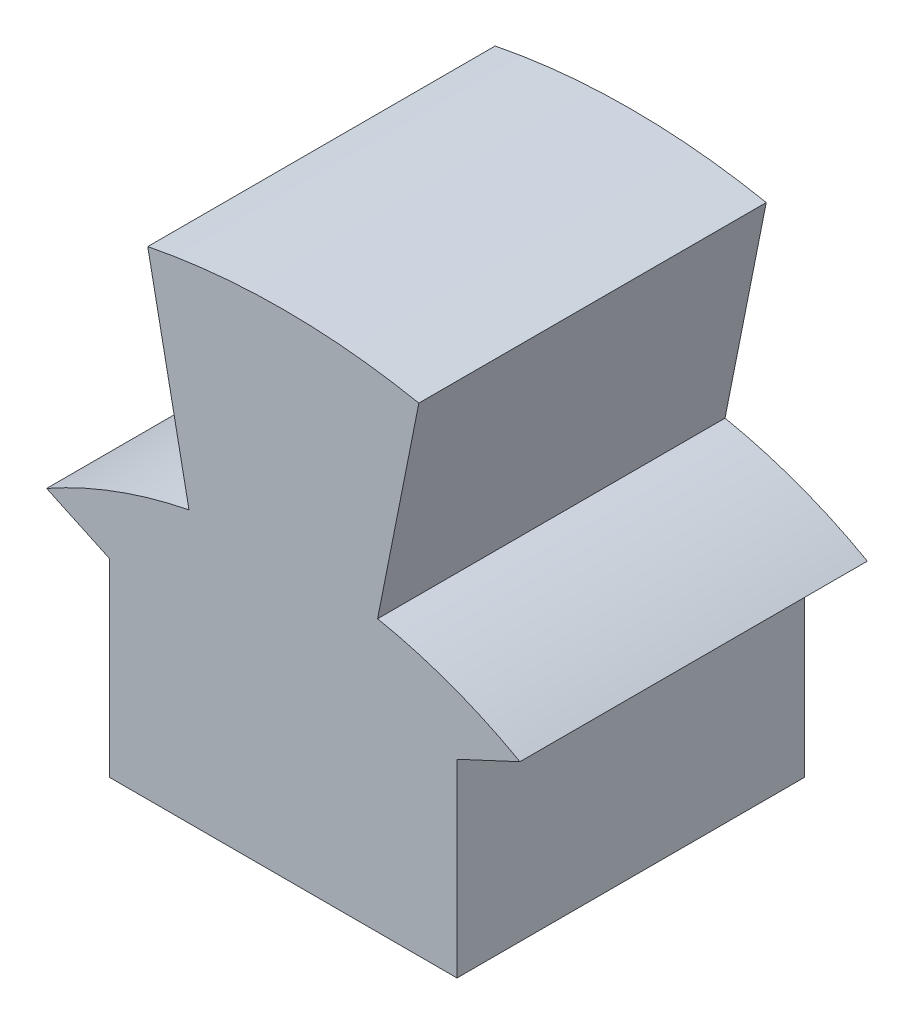
ISO-10303-21;
HEADER;
FILE_DESCRIPTION(('STEP AP214'),'2;1');
FILE_NAME('part.step','',(''),(''),'','','');
FILE_SCHEMA(('AUTOMOTIVE_DESIGN { 1 0 10303 214 1 1 1 1 }'));
ENDSEC;
DATA;
#1=APPLICATION_CONTEXT('core data for automotive mechanical design processes');
#2=APPLICATION_PROTOCOL_DEFINITION('international standard','automotive_design',2000,#1);
#3=PRODUCT_CONTEXT('',#1,'mechanical');
#4=PRODUCT('Part','Part','',(#3));
#5=PRODUCT_RELATED_PRODUCT_CATEGORY('part','',(#4));
#6=PRODUCT_DEFINITION_FORMATION('','',#4);
#7=PRODUCT_DEFINITION_CONTEXT('part definition',#1,'design');
#8=PRODUCT_DEFINITION('design','',#6,#7);
#9=PRODUCT_DEFINITION_SHAPE('','',#8);
#10=(LENGTH_UNIT() NAMED_UNIT(*) SI_UNIT(.MILLI.,.METRE.));
#11=(NAMED_UNIT(*) PLANE_ANGLE_UNIT() SI_UNIT($,.RADIAN.));
#12=(NAMED_UNIT(*) SI_UNIT($,.STERADIAN.) SOLID_ANGLE_UNIT());
#13=UNCERTAINTY_MEASURE_WITH_UNIT(LENGTH_MEASURE(1.E-05),#10,'distance_accuracy_value','');
#14=(GEOMETRIC_REPRESENTATION_CONTEXT(3) GLOBAL_UNCERTAINTY_ASSIGNED_CONTEXT((#13)) GLOBAL_UNIT_ASSIGNED_CONTEXT((#10,
#11,#12)) REPRESENTATION_CONTEXT('',''));
#15=CARTESIAN_POINT('',(0.,0.,0.));
#16=DIRECTION('',(0.,0.,1.));
#17=DIRECTION('',(1.,0.,0.));
#18=AXIS2_PLACEMENT_3D('',#15,#16,#17);
#19=CARTESIAN_POINT('',(0.,-12.,6.));
#20=DIRECTION('',(0.,0.,-1.));
#21=DIRECTION('',(-1.,0.,0.));
#22=AXIS2_PLACEMENT_3D('',#19,#20,#21);
#23=CYLINDRICAL_SURFACE('',#22,8.34804161020003);
#24=CARTESIAN_POINT('',(0.,-12.,0.));
#25=DIRECTION('',(0.,0.,1.));
#26=DIRECTION('',(1.,0.,0.));
#27=AXIS2_PLACEMENT_3D('',#24,#25,#26);
#28=CIRCLE('',#27,8.34804161020003);
#29=CARTESIAN_POINT('',(4.08742047855205,-4.7210720186868,0.));
#30=VERTEX_POINT('',#29);
#31=CARTESIAN_POINT('',(1.62862212593793,-3.81236366852213,0.));
#32=VERTEX_POINT('',#31);
#33=EDGE_CURVE('E142',#30,#32,#28,.T.);
#34=ORIENTED_EDGE('',*,*,#33,.T.);
#35=DIRECTION('',(0.,0.,-1.));
#36=VECTOR('',#35,1.);
#37=CARTESIAN_POINT('',(1.62862212593793,-3.81236366852213,6.));
#38=LINE('',#37,#36);
#39=CARTESIAN_POINT('',(1.62862212593793,-3.81236366852213,6.));
#40=VERTEX_POINT('',#39);
#41=EDGE_CURVE('E11',#40,#32,#38,.T.);
#42=ORIENTED_EDGE('',*,*,#41,.F.);
#43=CARTESIAN_POINT('',(0.,-12.,6.));
#44=DIRECTION('',(0.,0.,1.));
#45=DIRECTION('',(1.,0.,0.));
#46=AXIS2_PLACEMENT_3D('',#43,#44,#45);
#47=CIRCLE('',#46,8.34804161020003);
#48=CARTESIAN_POINT('',(4.08742047855205,-4.7210720186868,6.));
#49=VERTEX_POINT('',#48);
#50=EDGE_CURVE('E98',#49,#40,#47,.T.);
#51=ORIENTED_EDGE('',*,*,#50,.F.);
#52=DIRECTION('',(0.,0.,-1.));
#53=VECTOR('',#52,1.);
#54=CARTESIAN_POINT('',(4.08742047855205,-4.7210720186868,6.));
#55=LINE('',#54,#53);
#56=EDGE_CURVE('E138',#49,#30,#55,.T.);
#57=ORIENTED_EDGE('',*,*,#56,.T.);
#58=EDGE_LOOP('',(#34,#42,#51,#57));
#59=FACE_BOUND('',#58,.T.);
#60=ADVANCED_FACE('F35',(#59),#23,.T.);
#61=CARTESIAN_POINT('',(2.29610059419051,-0.456722804932274,6.));
#62=DIRECTION('',(0.98078528040323,-0.195090322016129,0.));
#63=DIRECTION('',(0.195090322016129,0.980785280403231,0.));
#64=AXIS2_PLACEMENT_3D('',#61,#62,#63);
#65=PLANE('',#64);
#66=DIRECTION('',(-0.195090322016129,-0.98078528040323,0.));
#67=VECTOR('',#66,1.);
#68=CARTESIAN_POINT('',(2.29610059419051,-0.456722804932274,0.));
#69=LINE('',#68,#67);
#70=CARTESIAN_POINT('',(2.34108386419351,-0.230576635161234,0.));
#71=VERTEX_POINT('',#70);
#72=EDGE_CURVE('E145',#71,#32,#69,.T.);
#73=ORIENTED_EDGE('',*,*,#72,.F.);
#74=DIRECTION('',(0.,0.,-1.));
#75=VECTOR('',#74,1.);
#76=CARTESIAN_POINT('',(2.34108386419351,-0.230576635161234,6.));
#77=LINE('',#76,#75);
#78=CARTESIAN_POINT('',(2.34108386419351,-0.230576635161234,6.));
#79=VERTEX_POINT('',#78);
#80=EDGE_CURVE('E44',#79,#71,#77,.T.);
#81=ORIENTED_EDGE('',*,*,#80,.F.);
#82=DIRECTION('',(-0.195090322016129,-0.98078528040323,0.));
#83=VECTOR('',#82,1.);
#84=CARTESIAN_POINT('',(2.29610059419051,-0.456722804932274,6.));
#85=LINE('',#84,#83);
#86=EDGE_CURVE('E196',#79,#40,#85,.T.);
#87=ORIENTED_EDGE('',*,*,#86,.T.);
#88=ORIENTED_EDGE('',*,*,#41,.T.);
#89=EDGE_LOOP('',(#73,#81,#87,#88));
#90=FACE_BOUND('',#89,.T.);
#91=ADVANCED_FACE('F37',(#90),#65,.T.);
#92=CARTESIAN_POINT('',(0.,-12.,6.));
#93=DIRECTION('',(0.,0.,-1.));
#94=DIRECTION('',(-1.,0.,0.));
#95=AXIS2_PLACEMENT_3D('',#92,#93,#94);
#96=CYLINDRICAL_SURFACE('',#95,12.);
#97=CARTESIAN_POINT('',(0.,-12.,0.));
#98=DIRECTION('',(0.,0.,1.));
#99=DIRECTION('',(1.,0.,0.));
#100=AXIS2_PLACEMENT_3D('',#97,#98,#99);
#101=CIRCLE('',#100,12.);
#102=CARTESIAN_POINT('',(-2.34108386419354,-0.230576635161228,0.));
#103=VERTEX_POINT('',#102);
#104=EDGE_CURVE('E149',#103,#71,#101,.F.);
#105=ORIENTED_EDGE('',*,*,#104,.F.);
#106=DIRECTION('',(0.,0.,-1.));
#107=VECTOR('',#106,1.);
#108=CARTESIAN_POINT('',(-2.34108386419354,-0.230576635161228,6.));
#109=LINE('',#108,#107);
#110=CARTESIAN_POINT('',(-2.34108386419354,-0.230576635161228,6.));
#111=VERTEX_POINT('',#110);
#112=EDGE_CURVE('E174',#111,#103,#109,.T.);
#113=ORIENTED_EDGE('',*,*,#112,.F.);
#114=CARTESIAN_POINT('',(0.,-12.,6.));
#115=DIRECTION('',(0.,0.,1.));
#116=DIRECTION('',(1.,0.,0.));
#117=AXIS2_PLACEMENT_3D('',#114,#115,#116);
#118=CIRCLE('',#117,12.);
#119=EDGE_CURVE('E181',#111,#79,#118,.F.);
#120=ORIENTED_EDGE('',*,*,#119,.T.);
#121=ORIENTED_EDGE('',*,*,#80,.T.);
#122=EDGE_LOOP('',(#105,#113,#120,#121));
#123=FACE_BOUND('',#122,.T.);
#124=ADVANCED_FACE('F179',(#123),#96,.T.);
#125=CARTESIAN_POINT('',(-2.29610059419054,-0.456722804932274,6.));
#126=DIRECTION('',(-0.980785280403231,-0.195090322016126,0.));
#127=DIRECTION('',(0.195090322016126,-0.980785280403231,0.));
#128=AXIS2_PLACEMENT_3D('',#125,#126,#127);
#129=PLANE('',#128);
#130=DIRECTION('',(-0.195090322016126,0.980785280403231,0.));
#131=VECTOR('',#130,1.);
#132=CARTESIAN_POINT('',(-2.29610059419054,-0.456722804932274,0.));
#133=LINE('',#132,#131);
#134=CARTESIAN_POINT('',(-1.62862212593798,-3.81236366852212,0.));
#135=VERTEX_POINT('',#134);
#136=EDGE_CURVE('E152',#135,#103,#133,.T.);
#137=ORIENTED_EDGE('',*,*,#136,.F.);
#138=DIRECTION('',(0.,0.,-1.));
#139=VECTOR('',#138,1.);
#140=CARTESIAN_POINT('',(-1.62862212593798,-3.81236366852212,6.));
#141=LINE('',#140,#139);
#142=CARTESIAN_POINT('',(-1.62862212593798,-3.81236366852212,6.));
#143=VERTEX_POINT('',#142);
#144=EDGE_CURVE('E172',#143,#135,#141,.T.);
#145=ORIENTED_EDGE('',*,*,#144,.F.);
#146=DIRECTION('',(-0.195090322016126,0.980785280403231,0.));
#147=VECTOR('',#146,1.);
#148=CARTESIAN_POINT('',(-2.29610059419054,-0.456722804932274,6.));
#149=LINE('',#148,#147);
#150=EDGE_CURVE('E195',#143,#111,#149,.T.);
#151=ORIENTED_EDGE('',*,*,#150,.T.);
#152=ORIENTED_EDGE('',*,*,#112,.T.);
#153=EDGE_LOOP('',(#137,#145,#151,#152));
#154=FACE_BOUND('',#153,.T.);
#155=ADVANCED_FACE('F191',(#154),#129,.T.);
#156=CARTESIAN_POINT('',(-4.0874204785521,-4.7210720186868,0.));
#157=VERTEX_POINT('',#156);
#158=EDGE_CURVE('E146',#135,#157,#28,.T.);
#159=ORIENTED_EDGE('',*,*,#158,.T.);
#160=DIRECTION('',(0.,0.,-1.));
#161=VECTOR('',#160,1.);
#162=CARTESIAN_POINT('',(-4.0874204785521,-4.7210720186868,6.));
#163=LINE('',#162,#161);
#164=CARTESIAN_POINT('',(-4.0874204785521,-4.7210720186868,6.));
#165=VERTEX_POINT('',#164);
#166=EDGE_CURVE('E169',#165,#157,#163,.T.);
#167=ORIENTED_EDGE('',*,*,#166,.F.);
#168=EDGE_CURVE('E198',#143,#165,#47,.T.);
#169=ORIENTED_EDGE('',*,*,#168,.F.);
#170=ORIENTED_EDGE('',*,*,#144,.T.);
#171=EDGE_LOOP('',(#159,#167,#169,#170));
#172=FACE_BOUND('',#171,.T.);
#173=ADVANCED_FACE('F221',(#172),#23,.T.);
#174=CARTESIAN_POINT('',(-2.53831411241967,-5.44343218051102,6.));
#175=DIRECTION('',(0.422618261740702,0.906307787036649,0.));
#176=DIRECTION('',(-0.906307787036649,0.422618261740702,0.));
#177=AXIS2_PLACEMENT_3D('',#174,#175,#176);
#178=PLANE('',#177);
#179=DIRECTION('',(0.906307787036649,-0.422618261740702,0.));
#180=VECTOR('',#179,1.);
#181=CARTESIAN_POINT('',(-2.53831411241967,-5.44343218051102,0.));
#182=LINE('',#181,#180);
#183=CARTESIAN_POINT('',(-3.00000000000003,-5.22814451547021,0.));
#184=VERTEX_POINT('',#183);
#185=EDGE_CURVE('E155',#157,#184,#182,.T.);
#186=ORIENTED_EDGE('',*,*,#185,.T.);
#187=DIRECTION('',(0.,0.,-1.));
#188=VECTOR('',#187,1.);
#189=CARTESIAN_POINT('',(-3.00000000000003,-5.22814451547021,6.));
#190=LINE('',#189,#188);
#191=CARTESIAN_POINT('',(-3.00000000000003,-5.22814451547021,6.));
#192=VERTEX_POINT('',#191);
#193=EDGE_CURVE('E167',#192,#184,#190,.T.);
#194=ORIENTED_EDGE('',*,*,#193,.F.);
#195=DIRECTION('',(0.906307787036649,-0.422618261740702,0.));
#196=VECTOR('',#195,1.);
#197=CARTESIAN_POINT('',(-2.53831411241967,-5.44343218051102,6.));
#198=LINE('',#197,#196);
#199=EDGE_CURVE('E203',#165,#192,#198,.T.);
#200=ORIENTED_EDGE('',*,*,#199,.F.);
#201=ORIENTED_EDGE('',*,*,#166,.T.);
#202=EDGE_LOOP('',(#186,#194,#200,#201));
#203=FACE_BOUND('',#202,.T.);
#204=ADVANCED_FACE('F228',(#203),#178,.F.);
#205=CARTESIAN_POINT('',(-3.00000000000003,0.,6.));
#206=DIRECTION('',(-1.,0.,0.));
#207=DIRECTION('',(0.,-1.,0.));
#208=AXIS2_PLACEMENT_3D('',#205,#206,#207);
#209=PLANE('',#208);
#210=DIRECTION('',(0.,1.,0.));
#211=VECTOR('',#210,1.);
#212=CARTESIAN_POINT('',(-3.00000000000003,0.,0.));
#213=LINE('',#212,#211);
#214=CARTESIAN_POINT('',(-3.00000000000003,-8.5,0.));
#215=VERTEX_POINT('',#214);
#216=EDGE_CURVE('E158',#215,#184,#213,.T.);
#217=ORIENTED_EDGE('',*,*,#216,.F.);
#218=DIRECTION('',(0.,0.,-1.));
#219=VECTOR('',#218,1.);
#220=CARTESIAN_POINT('',(-3.00000000000003,-8.5,6.));
#221=LINE('',#220,#219);
#222=CARTESIAN_POINT('',(-3.00000000000003,-8.5,6.));
#223=VERTEX_POINT('',#222);
#224=EDGE_CURVE('E133',#223,#215,#221,.T.);
#225=ORIENTED_EDGE('',*,*,#224,.F.);
#226=DIRECTION('',(0.,1.,0.));
#227=VECTOR('',#226,1.);
#228=CARTESIAN_POINT('',(-3.00000000000003,0.,6.));
#229=LINE('',#228,#227);
#230=EDGE_CURVE('E126',#223,#192,#229,.T.);
#231=ORIENTED_EDGE('',*,*,#230,.T.);
#232=ORIENTED_EDGE('',*,*,#193,.T.);
#233=EDGE_LOOP('',(#217,#225,#231,#232));
#234=FACE_BOUND('',#233,.T.);
#235=ADVANCED_FACE('F206',(#234),#209,.T.);
#236=CARTESIAN_POINT('',(0.,-8.5,6.));
#237=DIRECTION('',(0.,1.,0.));
#238=DIRECTION('',(0.,0.,1.));
#239=AXIS2_PLACEMENT_3D('',#236,#237,#238);
#240=PLANE('',#239);
#241=DIRECTION('',(1.,0.,0.));
#242=VECTOR('',#241,1.);
#243=CARTESIAN_POINT('',(0.,-8.5,0.));
#244=LINE('',#243,#242);
#245=CARTESIAN_POINT('',(2.99999999999997,-8.5,0.));
#246=VERTEX_POINT('',#245);
#247=EDGE_CURVE('E132',#215,#246,#244,.T.);
#248=ORIENTED_EDGE('',*,*,#247,.T.);
#249=DIRECTION('',(0.,0.,-1.));
#250=VECTOR('',#249,1.);
#251=CARTESIAN_POINT('',(2.99999999999997,-8.5,6.));
#252=LINE('',#251,#250);
#253=CARTESIAN_POINT('',(2.99999999999997,-8.5,6.));
#254=VERTEX_POINT('',#253);
#255=EDGE_CURVE('E129',#254,#246,#252,.T.);
#256=ORIENTED_EDGE('',*,*,#255,.F.);
#257=DIRECTION('',(1.,0.,0.));
#258=VECTOR('',#257,1.);
#259=CARTESIAN_POINT('',(0.,-8.5,6.));
#260=LINE('',#259,#258);
#261=EDGE_CURVE('E120',#223,#254,#260,.T.);
#262=ORIENTED_EDGE('',*,*,#261,.F.);
#263=ORIENTED_EDGE('',*,*,#224,.T.);
#264=EDGE_LOOP('',(#248,#256,#262,#263));
#265=FACE_BOUND('',#264,.T.);
#266=ADVANCED_FACE('F130',(#265),#240,.F.);
#267=CARTESIAN_POINT('',(2.99999999999997,0.,6.));
#268=DIRECTION('',(-1.,0.,0.));
#269=DIRECTION('',(0.,-1.,0.));
#270=AXIS2_PLACEMENT_3D('',#267,#268,#269);
#271=PLANE('',#270);
#272=DIRECTION('',(0.,1.,0.));
#273=VECTOR('',#272,1.);
#274=CARTESIAN_POINT('',(2.99999999999997,0.,0.));
#275=LINE('',#274,#273);
#276=CARTESIAN_POINT('',(2.99999999999997,-5.22814451547021,0.));
#277=VERTEX_POINT('',#276);
#278=EDGE_CURVE('E86',#246,#277,#275,.T.);
#279=ORIENTED_EDGE('',*,*,#278,.T.);
#280=DIRECTION('',(0.,0.,-1.));
#281=VECTOR('',#280,1.);
#282=CARTESIAN_POINT('',(2.99999999999997,-5.22814451547021,6.));
#283=LINE('',#282,#281);
#284=CARTESIAN_POINT('',(2.99999999999997,-5.22814451547021,6.));
#285=VERTEX_POINT('',#284);
#286=EDGE_CURVE('E134',#285,#277,#283,.T.);
#287=ORIENTED_EDGE('',*,*,#286,.F.);
#288=DIRECTION('',(0.,1.,0.));
#289=VECTOR('',#288,1.);
#290=CARTESIAN_POINT('',(2.99999999999997,0.,6.));
#291=LINE('',#290,#289);
#292=EDGE_CURVE('E124',#254,#285,#291,.T.);
#293=ORIENTED_EDGE('',*,*,#292,.F.);
#294=ORIENTED_EDGE('',*,*,#255,.T.);
#295=EDGE_LOOP('',(#279,#287,#293,#294));
#296=FACE_BOUND('',#295,.T.);
#297=ADVANCED_FACE('F136',(#296),#271,.F.);
#298=CARTESIAN_POINT('',(2.53831411241962,-5.44343218051101,6.));
#299=DIRECTION('',(-0.422618261740696,0.906307787036651,0.));
#300=DIRECTION('',(-0.906307787036652,-0.422618261740696,0.));
#301=AXIS2_PLACEMENT_3D('',#298,#299,#300);
#302=PLANE('',#301);
#303=DIRECTION('',(0.906307787036652,0.422618261740696,0.));
#304=VECTOR('',#303,1.);
#305=CARTESIAN_POINT('',(2.53831411241962,-5.44343218051101,0.));
#306=LINE('',#305,#304);
#307=EDGE_CURVE('E92',#277,#30,#306,.T.);
#308=ORIENTED_EDGE('',*,*,#307,.T.);
#309=ORIENTED_EDGE('',*,*,#56,.F.);
#310=DIRECTION('',(0.906307787036652,0.422618261740696,0.));
#311=VECTOR('',#310,1.);
#312=CARTESIAN_POINT('',(2.53831411241962,-5.44343218051101,6.));
#313=LINE('',#312,#311);
#314=EDGE_CURVE('E52',#285,#49,#313,.T.);
#315=ORIENTED_EDGE('',*,*,#314,.F.);
#316=ORIENTED_EDGE('',*,*,#286,.T.);
#317=EDGE_LOOP('',(#308,#309,#315,#316));
#318=FACE_BOUND('',#317,.T.);
#319=ADVANCED_FACE('F209',(#318),#302,.F.);
#320=CARTESIAN_POINT('',(0.,0.,6.));
#321=DIRECTION('',(0.,0.,1.));
#322=DIRECTION('',(1.,0.,0.));
#323=AXIS2_PLACEMENT_3D('',#320,#321,#322);
#324=PLANE('',#323);
#325=ORIENTED_EDGE('',*,*,#50,.T.);
#326=ORIENTED_EDGE('',*,*,#86,.F.);
#327=ORIENTED_EDGE('',*,*,#119,.F.);
#328=ORIENTED_EDGE('',*,*,#150,.F.);
#329=ORIENTED_EDGE('',*,*,#168,.T.);
#330=ORIENTED_EDGE('',*,*,#199,.T.);
#331=ORIENTED_EDGE('',*,*,#230,.F.);
#332=ORIENTED_EDGE('',*,*,#261,.T.);
#333=ORIENTED_EDGE('',*,*,#292,.T.);
#334=ORIENTED_EDGE('',*,*,#314,.T.);
#335=EDGE_LOOP('',(#325,#326,#327,#328,#329,#330,#331,#332,#333,#334));
#336=FACE_BOUND('',#335,.T.);
#337=ADVANCED_FACE('F122',(#336),#324,.T.);
#338=CARTESIAN_POINT('',(0.,0.,0.));
#339=DIRECTION('',(0.,0.,1.));
#340=DIRECTION('',(1.,0.,0.));
#341=AXIS2_PLACEMENT_3D('',#338,#339,#340);
#342=PLANE('',#341);
#343=ORIENTED_EDGE('',*,*,#33,.F.);
#344=ORIENTED_EDGE('',*,*,#307,.F.);
#345=ORIENTED_EDGE('',*,*,#278,.F.);
#346=ORIENTED_EDGE('',*,*,#247,.F.);
#347=ORIENTED_EDGE('',*,*,#216,.T.);
#348=ORIENTED_EDGE('',*,*,#185,.F.);
#349=ORIENTED_EDGE('',*,*,#158,.F.);
#350=ORIENTED_EDGE('',*,*,#136,.T.);
#351=ORIENTED_EDGE('',*,*,#104,.T.);
#352=ORIENTED_EDGE('',*,*,#72,.T.);
#353=EDGE_LOOP('',(#343,#344,#345,#346,#347,#348,#349,#350,#351,#352));
#354=FACE_BOUND('',#353,.T.);
#355=ADVANCED_FACE('F186',(#354),#342,.F.);
#356=CLOSED_SHELL('',(#60,#91,#124,#155,#173,#204,#235,#266,#297,#319,#337,#355));
#357=MANIFOLD_SOLID_BREP('B2',#356);
#358=ADVANCED_BREP_SHAPE_REPRESENTATION('',(#18,#357),#14);
#359=SHAPE_DEFINITION_REPRESENTATION(#9,#358);
ENDSEC;
END-ISO-10303-21;
